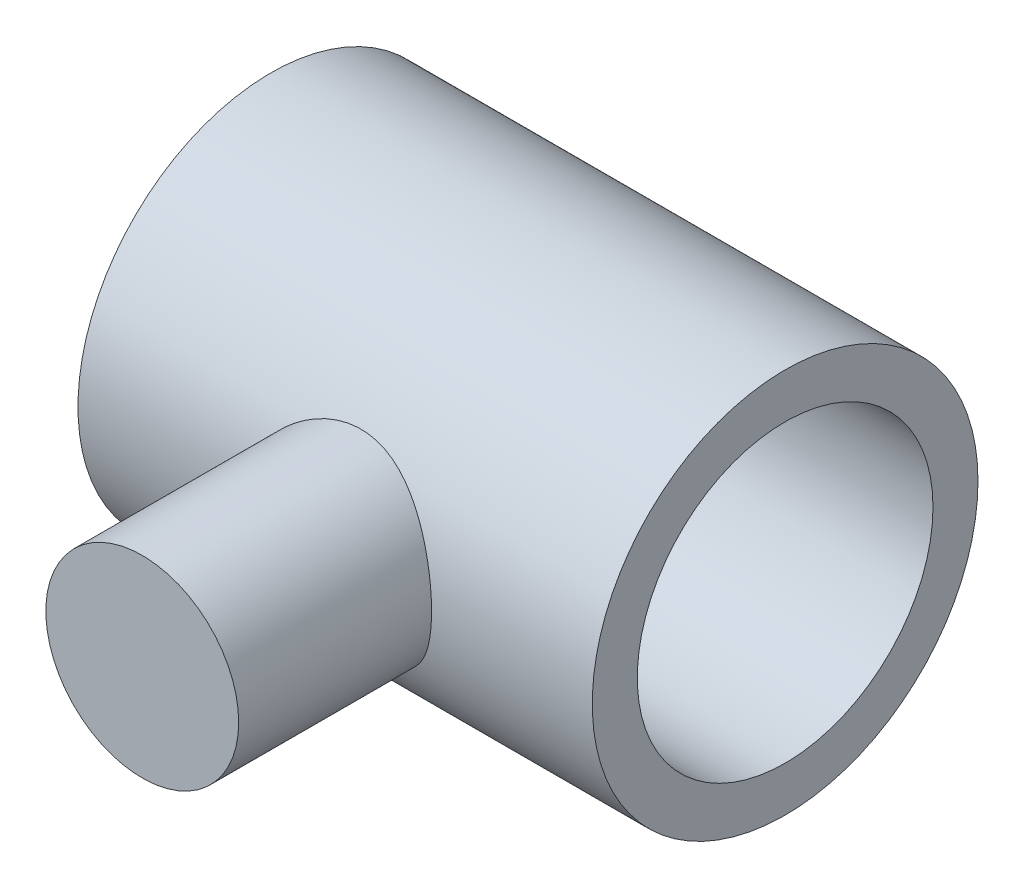
ISO-10303-21;
HEADER;
FILE_DESCRIPTION(('STEP AP214'),'2;1');
FILE_NAME('part.step','',(''),(''),'','','');
FILE_SCHEMA(('AUTOMOTIVE_DESIGN { 1 0 10303 214 1 1 1 1 }'));
ENDSEC;
DATA;
#1=APPLICATION_CONTEXT('core data for automotive mechanical design processes');
#2=APPLICATION_PROTOCOL_DEFINITION('international standard','automotive_design',2000,#1);
#3=PRODUCT_CONTEXT('',#1,'mechanical');
#4=PRODUCT('Part','Part','',(#3));
#5=PRODUCT_RELATED_PRODUCT_CATEGORY('part','',(#4));
#6=PRODUCT_DEFINITION_FORMATION('','',#4);
#7=PRODUCT_DEFINITION_CONTEXT('part definition',#1,'design');
#8=PRODUCT_DEFINITION('design','',#6,#7);
#9=PRODUCT_DEFINITION_SHAPE('','',#8);
#10=(LENGTH_UNIT() NAMED_UNIT(*) SI_UNIT(.MILLI.,.METRE.));
#11=(NAMED_UNIT(*) PLANE_ANGLE_UNIT() SI_UNIT($,.RADIAN.));
#12=(NAMED_UNIT(*) SI_UNIT($,.STERADIAN.) SOLID_ANGLE_UNIT());
#13=UNCERTAINTY_MEASURE_WITH_UNIT(LENGTH_MEASURE(1.E-05),#10,'distance_accuracy_value','');
#14=(GEOMETRIC_REPRESENTATION_CONTEXT(3) GLOBAL_UNCERTAINTY_ASSIGNED_CONTEXT((#13)) GLOBAL_UNIT_ASSIGNED_CONTEXT((#10,
#11,#12)) REPRESENTATION_CONTEXT('',''));
#15=CARTESIAN_POINT('',(0.,0.,0.));
#16=DIRECTION('',(0.,0.,1.));
#17=DIRECTION('',(1.,0.,0.));
#18=AXIS2_PLACEMENT_3D('',#15,#16,#17);
#19=CARTESIAN_POINT('',(-20.,15.,0.));
#20=DIRECTION('',(-1.,0.,0.));
#21=DIRECTION('',(0.,0.,1.));
#22=AXIS2_PLACEMENT_3D('',#19,#20,#21);
#23=PLANE('',#22);
#24=CARTESIAN_POINT('',(-20.,0.,0.));
#25=DIRECTION('',(1.,0.,0.));
#26=DIRECTION('',(0.,0.,-1.));
#27=AXIS2_PLACEMENT_3D('',#24,#25,#26);
#28=CIRCLE('',#27,11.5);
#29=CARTESIAN_POINT('',(-20.,0.,-11.5));
#30=VERTEX_POINT('',#29);
#31=EDGE_CURVE('E58',#30,#30,#28,.T.);
#32=ORIENTED_EDGE('',*,*,#31,.T.);
#33=EDGE_LOOP('',(#32));
#34=FACE_BOUND('',#33,.T.);
#35=CARTESIAN_POINT('',(-20.,0.,0.));
#36=DIRECTION('',(1.,0.,0.));
#37=DIRECTION('',(0.,0.,-1.));
#38=AXIS2_PLACEMENT_3D('',#35,#36,#37);
#39=CIRCLE('',#38,15.);
#40=CARTESIAN_POINT('',(-20.,0.,-15.));
#41=VERTEX_POINT('',#40);
#42=EDGE_CURVE('E45',#41,#41,#39,.T.);
#43=ORIENTED_EDGE('',*,*,#42,.F.);
#44=EDGE_LOOP('',(#43));
#45=FACE_BOUND('',#44,.T.);
#46=ADVANCED_FACE('F35',(#34,#45),#23,.T.);
#47=CARTESIAN_POINT('',(58.1789137380192,0.,0.));
#48=DIRECTION('',(1.,0.,0.));
#49=DIRECTION('',(0.,0.,-1.));
#50=AXIS2_PLACEMENT_3D('',#47,#48,#49);
#51=CYLINDRICAL_SURFACE('',#50,15.);
#52=CARTESIAN_POINT('',(7.5,0.,15.));
#53=CARTESIAN_POINT('',(7.49999934165401,0.197233319634611,14.999999396748));
#54=CARTESIAN_POINT('',(7.4922108377573,0.394480447697189,14.9961007967494));
#55=CARTESIAN_POINT('',(7.46114565814667,0.787521887153942,14.9806046675974));
#56=CARTESIAN_POINT('',(7.43786224458164,0.983315529042056,14.9690037891683));
#57=CARTESIAN_POINT('',(7.37603884856931,1.37217475867236,14.9383810125726));
#58=CARTESIAN_POINT('',(7.33747711135517,1.56523604806031,14.9193485331296));
#59=CARTESIAN_POINT('',(7.24552395788685,1.94703954292032,14.8743407347001));
#60=CARTESIAN_POINT('',(7.19212647435577,2.13577994705356,14.8483625753491));
#61=CARTESIAN_POINT('',(7.07133190413741,2.50682232648196,14.7902312659494));
#62=CARTESIAN_POINT('',(7.00399647653593,2.68914865467159,14.7581053582234));
#63=CARTESIAN_POINT('',(6.85582459452157,3.04717071465554,14.6883654003789));
#64=CARTESIAN_POINT('',(6.77498330911654,3.22286404618521,14.6507493870819));
#65=CARTESIAN_POINT('',(6.51330580443152,3.73833299838093,14.5309652318162));
#66=CARTESIAN_POINT('',(6.31318248999107,4.06690309396203,14.4417945935421));
#67=CARTESIAN_POINT('',(5.8535616950305,4.70640207469269,14.2466964933283));
#68=CARTESIAN_POINT('',(5.59120465796308,5.01506114711124,14.1400816438171));
#69=CARTESIAN_POINT('',(5.16368500235218,5.44308231880778,13.9784212341451));
#70=CARTESIAN_POINT('',(5.01539572862678,5.58001386248577,13.9242051894336));
#71=CARTESIAN_POINT('',(4.70805440090902,5.84165491097173,13.8164776143495));
#72=CARTESIAN_POINT('',(4.54900056322214,5.96636238182052,13.7629662024985));
#73=CARTESIAN_POINT('',(4.20810276374793,6.21203614609388,13.6539394008805));
#74=CARTESIAN_POINT('',(4.02544863270177,6.33195448776317,13.5985925588041));
#75=CARTESIAN_POINT('',(3.64953283334442,6.5558172168629,13.492094780061));
#76=CARTESIAN_POINT('',(3.45627565417591,6.65976829479199,13.4409420901998));
#77=CARTESIAN_POINT('',(3.06022539847059,6.85079105860991,13.3445910586524));
#78=CARTESIAN_POINT('',(2.85743525551221,6.93786789550111,13.2993909012603));
#79=CARTESIAN_POINT('',(2.44358558816613,7.09420885808463,13.2166574842323));
#80=CARTESIAN_POINT('',(2.23252698307271,7.16347495754887,13.1791233751457));
#81=CARTESIAN_POINT('',(1.81656370686997,7.27969095551671,13.115267177794));
#82=CARTESIAN_POINT('',(1.61204530521996,7.32772731202127,13.088409003038));
#83=CARTESIAN_POINT('',(1.1987126545535,7.40657415403486,13.0439533148363));
#84=CARTESIAN_POINT('',(0.989898589695089,7.43738537640827,13.0263554052528));
#85=CARTESIAN_POINT('',(0.569989048896731,7.48128583073154,13.0011924893624));
#86=CARTESIAN_POINT('',(0.358895655336287,7.49439005257303,12.993618996979));
#87=CARTESIAN_POINT('',(-0.0637518792308911,7.50270600478308,12.9888194928446));
#88=CARTESIAN_POINT('',(-0.275305974353422,7.49791944225105,12.9915924938538));
#89=CARTESIAN_POINT('',(-0.671553641131383,7.47218723712111,13.0064057924061));
#90=CARTESIAN_POINT('',(-0.856425228133029,7.4532487913187,13.0172945533465));
#91=CARTESIAN_POINT('',(-1.22372944987351,7.40181622089092,13.0466085215773));
#92=CARTESIAN_POINT('',(-1.40616125790616,7.3693176158615,13.065036219764));
#93=CARTESIAN_POINT('',(-1.76729391820143,7.29114561844775,13.1088213055836));
#94=CARTESIAN_POINT('',(-1.94599526983101,7.24547400171689,13.1341777592319));
#95=CARTESIAN_POINT('',(-2.29871470784802,7.14141020631305,13.1910489784068));
#96=CARTESIAN_POINT('',(-2.47273089390029,7.08301295083101,13.222566201213));
#97=CARTESIAN_POINT('',(-2.81903471969544,6.952557362139,13.2916331750086));
#98=CARTESIAN_POINT('',(-2.9911919875581,6.88021734471418,13.3293043213991));
#99=CARTESIAN_POINT('',(-3.32882192958524,6.72336395223287,13.4091058014596));
#100=CARTESIAN_POINT('',(-3.49429235949025,6.63884653289771,13.4512376153395));
#101=CARTESIAN_POINT('',(-3.97958377474883,6.36789880537373,13.5827161365204));
#102=CARTESIAN_POINT('',(-4.28844406726538,6.16401254035423,13.6771793137098));
#103=CARTESIAN_POINT('',(-4.90899891929447,5.68542700201844,13.8835116827651));
#104=CARTESIAN_POINT('',(-5.21608716337201,5.40502682962122,13.9960691755619));
#105=CARTESIAN_POINT('',(-5.63936281851811,4.94881247274571,14.1610583156088));
#106=CARTESIAN_POINT('',(-5.77430080587805,4.79069598182255,14.2154461134507));
#107=CARTESIAN_POINT('',(-6.03101479487619,4.46319636456159,14.3216433742747));
#108=CARTESIAN_POINT('',(-6.15278907518224,4.29381176943409,14.3734524995837));
#109=CARTESIAN_POINT('',(-6.38762988189349,3.93649737411745,14.4755004113358));
#110=CARTESIAN_POINT('',(-6.50002243224581,3.74807068630637,14.5255523150677));
#111=CARTESIAN_POINT('',(-6.70832389206229,3.36104932929111,14.6199518429338));
#112=CARTESIAN_POINT('',(-6.80424021214315,3.16245928376597,14.6643020292947));
#113=CARTESIAN_POINT('',(-6.97859593512631,2.75644498721039,14.7460120172744));
#114=CARTESIAN_POINT('',(-7.05704212812565,2.54902420588262,14.7833745338763));
#115=CARTESIAN_POINT('',(-7.19553802870837,2.12686703288174,14.8499857401209));
#116=CARTESIAN_POINT('',(-7.25558985257935,1.91213148593978,14.8792353631224));
#117=CARTESIAN_POINT('',(-7.35229940897279,1.49520060410314,14.9266434935569));
#118=CARTESIAN_POINT('',(-7.39048293582342,1.29343993576982,14.9455200325964));
#119=CARTESIAN_POINT('',(-7.45021136496797,0.886879460889933,14.9751451894528));
#120=CARTESIAN_POINT('',(-7.47175717228376,0.682079820268408,14.9858942493696));
#121=CARTESIAN_POINT('',(-7.4979197418927,0.271216089694763,14.9989557072523));
#122=CARTESIAN_POINT('',(-7.5025432728685,0.0651525383335571,15.0012714784182));
#123=CARTESIAN_POINT('',(-7.49481660765514,-0.346571468999536,14.9974085489777));
#124=CARTESIAN_POINT('',(-7.48246716265361,-0.552231942407387,14.9912302243018));
#125=CARTESIAN_POINT('',(-7.44258232429303,-0.945483703972699,14.9713647745727));
#126=CARTESIAN_POINT('',(-7.41630345572036,-1.133235693275,14.9582993834851));
#127=CARTESIAN_POINT('',(-7.34973878465346,-1.5057028354874,14.9254086100729));
#128=CARTESIAN_POINT('',(-7.3094482269201,-1.69041693509205,14.9055809328309));
#129=CARTESIAN_POINT('',(-7.21529769331043,-2.05548161642884,14.8596377637143));
#130=CARTESIAN_POINT('',(-7.16144206620964,-2.23583357633264,14.8335242870997));
#131=CARTESIAN_POINT('',(-7.04065229404965,-2.59122720556855,14.7755872196551));
#132=CARTESIAN_POINT('',(-6.97371305902647,-2.76626677748716,14.743761406929));
#133=CARTESIAN_POINT('',(-6.82528075514793,-3.11487231777693,14.6741281629767));
#134=CARTESIAN_POINT('',(-6.74343070264121,-3.28825774429607,14.636177437618));
#135=CARTESIAN_POINT('',(-6.5671873298312,-3.62748137850216,14.5558172256269));
#136=CARTESIAN_POINT('',(-6.47278975755672,-3.79331700210342,14.5134062285665));
#137=CARTESIAN_POINT('',(-6.17179238541556,-4.27827609975167,14.3808355856941));
#138=CARTESIAN_POINT('',(-5.94730974946619,-4.58503393852599,14.2853004428519));
#139=CARTESIAN_POINT('',(-5.43172459349958,-5.18834638761033,14.0780904901238));
#140=CARTESIAN_POINT('',(-5.13624471833163,-5.48094083116617,13.9657520358616));
#141=CARTESIAN_POINT('',(-4.65955501199399,-5.88061884377912,13.7999731666702));
#142=CARTESIAN_POINT('',(-4.49494948213962,-6.00738638095381,13.7451298302383));
#143=CARTESIAN_POINT('',(-4.15519636689283,-6.24720364816647,13.6378032341987));
#144=CARTESIAN_POINT('',(-3.98004721010423,-6.36025132582032,13.5853203284304));
#145=CARTESIAN_POINT('',(-3.61130539306229,-6.57696128828773,13.4817918944242));
#146=CARTESIAN_POINT('',(-3.41722979080831,-6.6798962551633,13.430941525462));
#147=CARTESIAN_POINT('',(-3.01964110137598,-6.86878239405518,13.3353302893677));
#148=CARTESIAN_POINT('',(-2.81613262205679,-6.95474175273572,13.2905664901842));
#149=CARTESIAN_POINT('',(-2.40108760257022,-7.10870779446041,13.2088558963579));
#150=CARTESIAN_POINT('',(-2.18955766379467,-7.17672888846673,13.1719028316166));
#151=CARTESIAN_POINT('',(-1.75996258847434,-7.29397564807538,13.1073420248172));
#152=CARTESIAN_POINT('',(-1.54189846944785,-7.3432042238577,13.0797328358565));
#153=CARTESIAN_POINT('',(-1.12235640246318,-7.41830673858422,13.0372695609292));
#154=CARTESIAN_POINT('',(-0.921295683994895,-7.4459689347645,13.021445483554));
#155=CARTESIAN_POINT('',(-0.517079505524914,-7.48490769106324,12.9991026119521));
#156=CARTESIAN_POINT('',(-0.313924188929108,-7.49618536553766,12.9925831848914));
#157=CARTESIAN_POINT('',(0.0926351766783329,-7.50218225151114,12.9891213170173));
#158=CARTESIAN_POINT('',(0.296039105860541,-7.49690758753643,12.9921753339361));
#159=CARTESIAN_POINT('',(0.701379082305167,-7.469894240452,13.0077254939855));
#160=CARTESIAN_POINT('',(0.903315189317883,-7.44815623134422,13.0202212505754));
#161=CARTESIAN_POINT('',(1.28483573048,-7.39139793729182,13.0525163509744));
#162=CARTESIAN_POINT('',(1.46471080115129,-7.35784677050872,13.0715029011715));
#163=CARTESIAN_POINT('',(1.82079669630918,-7.27791219467992,13.116176635625));
#164=CARTESIAN_POINT('',(1.99700628326532,-7.23152452505277,13.1418660444746));
#165=CARTESIAN_POINT('',(2.34467306008353,-7.1263938644485,13.1991699931078));
#166=CARTESIAN_POINT('',(2.51613088120076,-7.06765252360367,13.2307837414909));
#167=CARTESIAN_POINT('',(2.85353408054974,-6.93829971844233,13.2990730578631));
#168=CARTESIAN_POINT('',(3.01947729372527,-6.86768365648883,13.3357505854504));
#169=CARTESIAN_POINT('',(3.35594763611394,-6.71002238040005,13.4158088277434));
#170=CARTESIAN_POINT('',(3.52604045635914,-6.62219479035093,13.4594736551204));
#171=CARTESIAN_POINT('',(3.8583683761912,-6.43424064207575,13.5503300057645));
#172=CARTESIAN_POINT('',(4.02060078287681,-6.33410990987667,13.5975227237681));
#173=CARTESIAN_POINT('',(4.3365444384223,-6.12213847211231,13.6942686473789));
#174=CARTESIAN_POINT('',(4.49025343166358,-6.01029468923604,13.7438224714345));
#175=CARTESIAN_POINT('',(4.78851224113257,-5.77548095727847,13.8441367211459));
#176=CARTESIAN_POINT('',(4.93306142788286,-5.65251024494258,13.8948972293982));
#177=CARTESIAN_POINT('',(5.22944249767115,-5.38035188500559,14.0027054261897));
#178=CARTESIAN_POINT('',(5.38001622080073,-5.22979541793192,14.059765681286));
#179=CARTESIAN_POINT('',(5.66801477387748,-4.91618955858278,14.1724674726751));
#180=CARTESIAN_POINT('',(5.80544342873799,-4.75314382541697,14.2281094181856));
#181=CARTESIAN_POINT('',(6.06645975892837,-4.41516652803151,14.3365905676768));
#182=CARTESIAN_POINT('',(6.19003374141003,-4.24022347499012,14.3894269722129));
#183=CARTESIAN_POINT('',(6.42220279210997,-3.87959731338855,14.4908173199864));
#184=CARTESIAN_POINT('',(6.53080468190239,-3.69391915105052,14.5393732098486));
#185=CARTESIAN_POINT('',(6.73290996703928,-3.31135574476217,14.631264866461));
#186=CARTESIAN_POINT('',(6.82629106872306,-3.11439541624589,14.6745577030524));
#187=CARTESIAN_POINT('',(6.99591377973114,-2.71198022789959,14.7542266224255));
#188=CARTESIAN_POINT('',(7.0721638092108,-2.50652960021849,14.7906061018549));
#189=CARTESIAN_POINT('',(7.20651560973104,-2.08904591147876,14.8553158088887));
#190=CARTESIAN_POINT('',(7.26465696304846,-1.87702833672874,14.8836635799129));
#191=CARTESIAN_POINT('',(7.36220707042198,-1.44785490772257,14.9315196572219));
#192=CARTESIAN_POINT('',(7.40162726733748,-1.23070227758586,14.9510333627761));
#193=CARTESIAN_POINT('',(7.45421167667982,-0.844562643439684,14.9771457489839));
#194=CARTESIAN_POINT('',(7.47136759805728,-0.67623875837521,14.9857011054743));
#195=CARTESIAN_POINT('',(7.49426219985686,-0.338613325294028,14.9971285683414));
#196=CARTESIAN_POINT('',(7.50000056514646,-0.16931175042174,15.0000005178519));
#197=CARTESIAN_POINT('',(7.5,0.,15.));
#198=B_SPLINE_CURVE_WITH_KNOTS('',3,(#52,#53,#54,#55,#56,#57,#58,#59,#60,#61,#62,#63,#64,#65,
#66,#67,#68,#69,#70,#71,#72,#73,#74,#75,#76,#77,#78,#79,#80,#81,#82,#83,#84,#85,#86,#87,#88,#89,
#90,#91,#92,#93,#94,#95,#96,#97,#98,#99,#100,#101,#102,#103,#104,#105,#106,#107,#108,#109,#110,
#111,#112,#113,#114,#115,#116,#117,#118,#119,#120,#121,#122,#123,#124,#125,#126,#127,#128,#129,
#130,#131,#132,#133,#134,#135,#136,#137,#138,#139,#140,#141,#142,#143,#144,#145,#146,#147,#148,
#149,#150,#151,#152,#153,#154,#155,#156,#157,#158,#159,#160,#161,#162,#163,#164,#165,#166,#167,
#168,#169,#170,#171,#172,#173,#174,#175,#176,#177,#178,#179,#180,#181,#182,#183,#184,#185,#186,
#187,#188,#189,#190,#191,#192,#193,#194,#195,#196,#197),.UNSPECIFIED.,.T.,.F.,(4,2,2,2,2,2,2,2,
2,2,2,2,2,2,2,2,2,2,2,2,2,2,2,2,2,2,2,2,2,2,2,2,2,2,2,2,2,2,2,2,2,2,2,2,2,2,2,2,2,2,2,2,2,2,2,2,
2,2,2,2,2,2,2,2,2,2,2,2,2,2,2,2,4),(0.,0.591532941974835,1.18332327605673,1.77595930484633,
2.36883805772764,2.95914801973939,3.5496695871672,4.72943162533672,5.98056661136063,
6.60703434534513,7.23360614076149,7.90898079290037,8.58407167742325,9.25895615909367,
9.93376581833203,10.568238808629,11.2026846550832,11.8365930731243,12.4704410065579,
13.028257193232,13.5862578337467,14.1441832938005,14.7023317433305,15.273234855264,
15.8443280107123,16.9859990925924,18.2724305981166,18.9164473004745,19.5605481150863,
20.2347844625212,20.9087167558919,21.5823866537383,22.2559790161609,22.8737744253103,
23.4915362266238,24.109050904515,24.7265382534065,25.2959739410995,25.8656030708237,
26.4350498171613,27.0047185399872,27.5904412613962,28.176362974779,29.3476075788121,
30.6338695709977,31.2779290064003,31.9220846696311,32.5976781105397,33.2729449395212,
33.9476676191321,34.6222857698159,35.2321453015406,35.8419633531151,36.4515557926873,
37.0611232771687,37.6123930023859,38.1638459202211,38.7152252248815,39.2668185053849,
39.8552593497835,40.4439003831458,41.0326964570339,41.6215329502021,42.2821059690619,
42.942486187842,43.6035134248762,44.2642384827034,44.9300352143687,45.5955039784387,
46.2595077713263,46.9231051837462,47.4308830472037,47.9386749254899),.UNSPECIFIED.);
#199=CARTESIAN_POINT('',(7.5,0.,15.));
#200=VERTEX_POINT('',#199);
#201=EDGE_CURVE('E10',#200,#200,#198,.T.);
#202=ORIENTED_EDGE('',*,*,#201,.F.);
#203=EDGE_LOOP('',(#202));
#204=FACE_BOUND('',#203,.T.);
#205=ORIENTED_EDGE('',*,*,#42,.T.);
#206=EDGE_LOOP('',(#205));
#207=FACE_BOUND('',#206,.T.);
#208=CARTESIAN_POINT('',(20.,0.,0.));
#209=DIRECTION('',(1.,0.,0.));
#210=DIRECTION('',(0.,0.,-1.));
#211=AXIS2_PLACEMENT_3D('',#208,#209,#210);
#212=CIRCLE('',#211,15.);
#213=CARTESIAN_POINT('',(20.,0.,-15.));
#214=VERTEX_POINT('',#213);
#215=EDGE_CURVE('E49',#214,#214,#212,.T.);
#216=ORIENTED_EDGE('',*,*,#215,.F.);
#217=EDGE_LOOP('',(#216));
#218=FACE_BOUND('',#217,.T.);
#219=ADVANCED_FACE('F80',(#204,#207,#218),#51,.T.);
#220=CARTESIAN_POINT('',(20.,15.,0.));
#221=DIRECTION('',(1.,0.,0.));
#222=DIRECTION('',(0.,0.,-1.));
#223=AXIS2_PLACEMENT_3D('',#220,#221,#222);
#224=PLANE('',#223);
#225=ORIENTED_EDGE('',*,*,#215,.T.);
#226=EDGE_LOOP('',(#225));
#227=FACE_BOUND('',#226,.T.);
#228=CARTESIAN_POINT('',(20.,0.,0.));
#229=DIRECTION('',(1.,0.,0.));
#230=DIRECTION('',(0.,0.,-1.));
#231=AXIS2_PLACEMENT_3D('',#228,#229,#230);
#232=CIRCLE('',#231,11.5);
#233=CARTESIAN_POINT('',(20.,0.,-11.5));
#234=VERTEX_POINT('',#233);
#235=EDGE_CURVE('E53',#234,#234,#232,.T.);
#236=ORIENTED_EDGE('',*,*,#235,.F.);
#237=EDGE_LOOP('',(#236));
#238=FACE_BOUND('',#237,.T.);
#239=ADVANCED_FACE('F75',(#227,#238),#224,.T.);
#240=CARTESIAN_POINT('',(58.1789137380192,0.,0.));
#241=DIRECTION('',(1.,0.,0.));
#242=DIRECTION('',(0.,0.,-1.));
#243=AXIS2_PLACEMENT_3D('',#240,#241,#242);
#244=CYLINDRICAL_SURFACE('',#243,11.5);
#245=ORIENTED_EDGE('',*,*,#235,.T.);
#246=EDGE_LOOP('',(#245));
#247=FACE_BOUND('',#246,.T.);
#248=ORIENTED_EDGE('',*,*,#31,.F.);
#249=EDGE_LOOP('',(#248));
#250=FACE_BOUND('',#249,.T.);
#251=ADVANCED_FACE('F69',(#247,#250),#244,.F.);
#252=CARTESIAN_POINT('',(0.,0.,-15.002));
#253=DIRECTION('',(0.,0.,1.));
#254=DIRECTION('',(1.,0.,0.));
#255=AXIS2_PLACEMENT_3D('',#252,#253,#254);
#256=CYLINDRICAL_SURFACE('',#255,7.5);
#257=ORIENTED_EDGE('',*,*,#201,.T.);
#258=EDGE_LOOP('',(#257));
#259=FACE_BOUND('',#258,.T.);
#260=CARTESIAN_POINT('',(0.,0.,30.));
#261=DIRECTION('',(0.,0.,1.));
#262=DIRECTION('',(1.,0.,0.));
#263=AXIS2_PLACEMENT_3D('',#260,#261,#262);
#264=CIRCLE('',#263,7.5);
#265=CARTESIAN_POINT('',(7.5,0.,30.));
#266=VERTEX_POINT('',#265);
#267=EDGE_CURVE('E61',#266,#266,#264,.T.);
#268=ORIENTED_EDGE('',*,*,#267,.F.);
#269=EDGE_LOOP('',(#268));
#270=FACE_BOUND('',#269,.T.);
#271=ADVANCED_FACE('F67',(#259,#270),#256,.T.);
#272=CARTESIAN_POINT('',(0.,0.,30.));
#273=DIRECTION('',(0.,0.,1.));
#274=DIRECTION('',(1.,0.,0.));
#275=AXIS2_PLACEMENT_3D('',#272,#273,#274);
#276=PLANE('',#275);
#277=ORIENTED_EDGE('',*,*,#267,.T.);
#278=EDGE_LOOP('',(#277));
#279=FACE_BOUND('',#278,.T.);
#280=ADVANCED_FACE('F65',(#279),#276,.T.);
#281=CLOSED_SHELL('',(#46,#219,#239,#251,#271,#280));
#282=MANIFOLD_SOLID_BREP('B2',#281);
#283=ADVANCED_BREP_SHAPE_REPRESENTATION('',(#18,#282),#14);
#284=SHAPE_DEFINITION_REPRESENTATION(#9,#283);
ENDSEC;
END-ISO-10303-21;
